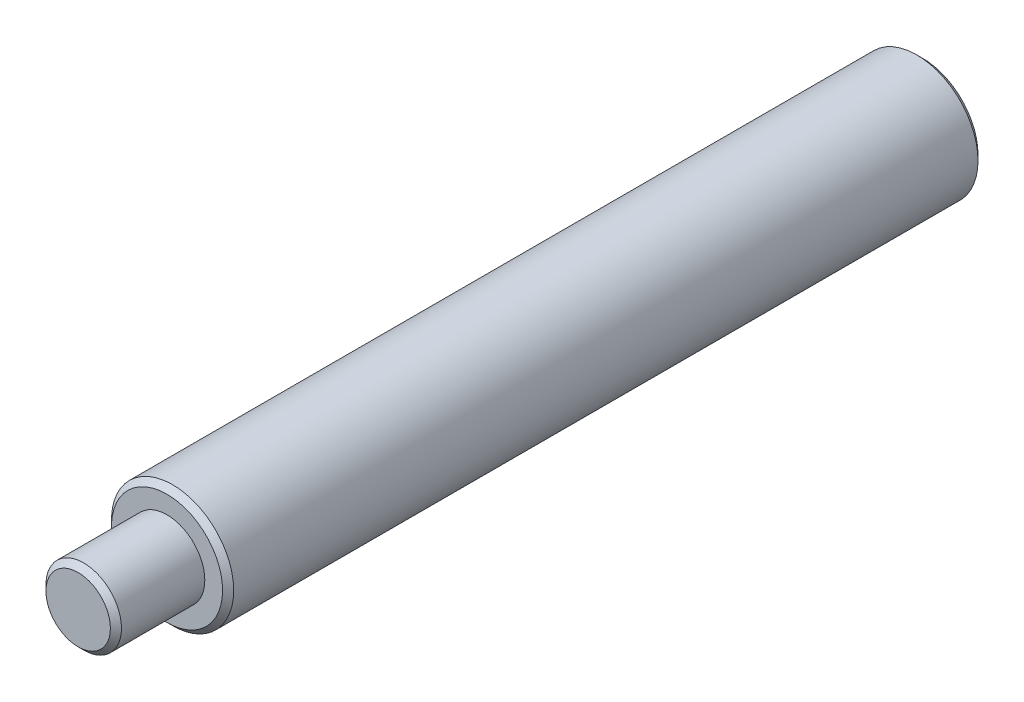
ISO-10303-21;
HEADER;
FILE_DESCRIPTION(('STEP AP214'),'2;1');
FILE_NAME('part.step','',(''),(''),'','','');
FILE_SCHEMA(('AUTOMOTIVE_DESIGN { 1 0 10303 214 1 1 1 1 }'));
ENDSEC;
DATA;
#1=APPLICATION_CONTEXT('core data for automotive mechanical design processes');
#2=APPLICATION_PROTOCOL_DEFINITION('international standard','automotive_design',2000,#1);
#3=PRODUCT_CONTEXT('',#1,'mechanical');
#4=PRODUCT('Part','Part','',(#3));
#5=PRODUCT_RELATED_PRODUCT_CATEGORY('part','',(#4));
#6=PRODUCT_DEFINITION_FORMATION('','',#4);
#7=PRODUCT_DEFINITION_CONTEXT('part definition',#1,'design');
#8=PRODUCT_DEFINITION('design','',#6,#7);
#9=PRODUCT_DEFINITION_SHAPE('','',#8);
#10=(LENGTH_UNIT() NAMED_UNIT(*) SI_UNIT(.MILLI.,.METRE.));
#11=(NAMED_UNIT(*) PLANE_ANGLE_UNIT() SI_UNIT($,.RADIAN.));
#12=(NAMED_UNIT(*) SI_UNIT($,.STERADIAN.) SOLID_ANGLE_UNIT());
#13=UNCERTAINTY_MEASURE_WITH_UNIT(LENGTH_MEASURE(1.E-05),#10,'distance_accuracy_value','');
#14=(GEOMETRIC_REPRESENTATION_CONTEXT(3) GLOBAL_UNCERTAINTY_ASSIGNED_CONTEXT((#13)) GLOBAL_UNIT_ASSIGNED_CONTEXT((#10,
#11,#12)) REPRESENTATION_CONTEXT('',''));
#15=CARTESIAN_POINT('',(0.,0.,0.));
#16=DIRECTION('',(0.,0.,1.));
#17=DIRECTION('',(1.,0.,0.));
#18=AXIS2_PLACEMENT_3D('',#15,#16,#17);
#19=CARTESIAN_POINT('',(0.,0.,68.));
#20=DIRECTION('',(0.,0.,1.));
#21=DIRECTION('',(1.,0.,0.));
#22=AXIS2_PLACEMENT_3D('',#19,#20,#21);
#23=PLANE('',#22);
#24=CARTESIAN_POINT('',(0.,0.,68.));
#25=DIRECTION('',(0.,0.,1.));
#26=DIRECTION('',(1.,0.,0.));
#27=AXIS2_PLACEMENT_3D('',#24,#25,#26);
#28=CIRCLE('',#27,5.);
#29=CARTESIAN_POINT('',(5.,0.,68.));
#30=VERTEX_POINT('',#29);
#31=EDGE_CURVE('E73',#30,#30,#28,.T.);
#32=ORIENTED_EDGE('',*,*,#31,.T.);
#33=EDGE_LOOP('',(#32));
#34=FACE_BOUND('',#33,.T.);
#35=CARTESIAN_POINT('',(0.,0.,68.));
#36=DIRECTION('',(0.,0.,1.));
#37=DIRECTION('',(1.,0.,0.));
#38=AXIS2_PLACEMENT_3D('',#35,#36,#37);
#39=CIRCLE('',#38,3.4);
#40=CARTESIAN_POINT('',(3.4,0.,68.));
#41=VERTEX_POINT('',#40);
#42=EDGE_CURVE('E59',#41,#41,#39,.T.);
#43=ORIENTED_EDGE('',*,*,#42,.F.);
#44=EDGE_LOOP('',(#43));
#45=FACE_BOUND('',#44,.T.);
#46=ADVANCED_FACE('F39',(#34,#45),#23,.T.);
#47=CARTESIAN_POINT('',(0.,0.,68.));
#48=DIRECTION('',(0.,0.,-1.));
#49=DIRECTION('',(-1.,0.,0.));
#50=AXIS2_PLACEMENT_3D('',#47,#48,#49);
#51=CYLINDRICAL_SURFACE('',#50,5.5);
#52=CARTESIAN_POINT('',(0.,0.,0.5));
#53=DIRECTION('',(0.,0.,1.));
#54=DIRECTION('',(1.,0.,0.));
#55=AXIS2_PLACEMENT_3D('',#52,#53,#54);
#56=CIRCLE('',#55,5.5);
#57=CARTESIAN_POINT('',(5.5,0.,0.5));
#58=VERTEX_POINT('',#57);
#59=EDGE_CURVE('E67',#58,#58,#56,.T.);
#60=ORIENTED_EDGE('',*,*,#59,.T.);
#61=EDGE_LOOP('',(#60));
#62=FACE_BOUND('',#61,.T.);
#63=CARTESIAN_POINT('',(0.,0.,67.5));
#64=DIRECTION('',(0.,0.,1.));
#65=DIRECTION('',(1.,0.,0.));
#66=AXIS2_PLACEMENT_3D('',#63,#64,#65);
#67=CIRCLE('',#66,5.5);
#68=CARTESIAN_POINT('',(5.5,0.,67.5));
#69=VERTEX_POINT('',#68);
#70=EDGE_CURVE('E62',#69,#69,#67,.F.);
#71=ORIENTED_EDGE('',*,*,#70,.T.);
#72=EDGE_LOOP('',(#71));
#73=FACE_BOUND('',#72,.T.);
#74=ADVANCED_FACE('F93',(#62,#73),#51,.T.);
#75=CARTESIAN_POINT('',(0.,0.,0.));
#76=DIRECTION('',(0.,0.,1.));
#77=DIRECTION('',(1.,0.,0.));
#78=AXIS2_PLACEMENT_3D('',#75,#76,#77);
#79=PLANE('',#78);
#80=CARTESIAN_POINT('',(0.,0.,0.));
#81=DIRECTION('',(0.,0.,1.));
#82=DIRECTION('',(1.,0.,0.));
#83=AXIS2_PLACEMENT_3D('',#80,#81,#82);
#84=CIRCLE('',#83,2.59999999999999);
#85=CARTESIAN_POINT('',(2.59999999999999,0.,0.));
#86=VERTEX_POINT('',#85);
#87=EDGE_CURVE('E11',#86,#86,#84,.T.);
#88=ORIENTED_EDGE('',*,*,#87,.T.);
#89=EDGE_LOOP('',(#88));
#90=FACE_BOUND('',#89,.T.);
#91=CARTESIAN_POINT('',(0.,0.,0.));
#92=DIRECTION('',(0.,0.,1.));
#93=DIRECTION('',(1.,0.,0.));
#94=AXIS2_PLACEMENT_3D('',#91,#92,#93);
#95=CIRCLE('',#94,4.99999999999999);
#96=CARTESIAN_POINT('',(4.99999999999999,0.,0.));
#97=VERTEX_POINT('',#96);
#98=EDGE_CURVE('E70',#97,#97,#95,.F.);
#99=ORIENTED_EDGE('',*,*,#98,.T.);
#100=EDGE_LOOP('',(#99));
#101=FACE_BOUND('',#100,.T.);
#102=ADVANCED_FACE('F99',(#90,#101),#79,.F.);
#103=CARTESIAN_POINT('',(0.,0.,0.5));
#104=DIRECTION('',(0.,0.,1.));
#105=DIRECTION('',(1.,0.,0.));
#106=AXIS2_PLACEMENT_3D('',#103,#104,#105);
#107=CONICAL_SURFACE('',#106,5.5,0.785398163397457);
#108=ORIENTED_EDGE('',*,*,#98,.F.);
#109=EDGE_LOOP('',(#108));
#110=FACE_BOUND('',#109,.T.);
#111=ORIENTED_EDGE('',*,*,#59,.F.);
#112=EDGE_LOOP('',(#111));
#113=FACE_BOUND('',#112,.T.);
#114=ADVANCED_FACE('F108',(#110,#113),#107,.T.);
#115=CARTESIAN_POINT('',(0.,0.,68.));
#116=DIRECTION('',(0.,0.,-1.));
#117=DIRECTION('',(-1.,0.,0.));
#118=AXIS2_PLACEMENT_3D('',#115,#116,#117);
#119=CONICAL_SURFACE('',#118,5.,0.785398163397457);
#120=ORIENTED_EDGE('',*,*,#70,.F.);
#121=EDGE_LOOP('',(#120));
#122=FACE_BOUND('',#121,.T.);
#123=ORIENTED_EDGE('',*,*,#31,.F.);
#124=EDGE_LOOP('',(#123));
#125=FACE_BOUND('',#124,.T.);
#126=ADVANCED_FACE('F113',(#122,#125),#119,.T.);
#127=CARTESIAN_POINT('',(0.,0.,76.));
#128=DIRECTION('',(0.,0.,-1.));
#129=DIRECTION('',(-1.,0.,0.));
#130=AXIS2_PLACEMENT_3D('',#127,#128,#129);
#131=CYLINDRICAL_SURFACE('',#130,3.4);
#132=CARTESIAN_POINT('',(0.,0.,75.5));
#133=DIRECTION('',(0.,0.,1.));
#134=DIRECTION('',(1.,0.,0.));
#135=AXIS2_PLACEMENT_3D('',#132,#133,#134);
#136=CIRCLE('',#135,3.4);
#137=CARTESIAN_POINT('',(3.4,0.,75.5));
#138=VERTEX_POINT('',#137);
#139=EDGE_CURVE('E79',#138,#138,#136,.F.);
#140=ORIENTED_EDGE('',*,*,#139,.T.);
#141=EDGE_LOOP('',(#140));
#142=FACE_BOUND('',#141,.T.);
#143=ORIENTED_EDGE('',*,*,#42,.T.);
#144=EDGE_LOOP('',(#143));
#145=FACE_BOUND('',#144,.T.);
#146=ADVANCED_FACE('F105',(#142,#145),#131,.T.);
#147=CARTESIAN_POINT('',(0.,0.,76.));
#148=DIRECTION('',(0.,0.,1.));
#149=DIRECTION('',(1.,0.,0.));
#150=AXIS2_PLACEMENT_3D('',#147,#148,#149);
#151=PLANE('',#150);
#152=CARTESIAN_POINT('',(0.,0.,76.));
#153=DIRECTION('',(0.,0.,1.));
#154=DIRECTION('',(1.,0.,0.));
#155=AXIS2_PLACEMENT_3D('',#152,#153,#154);
#156=CIRCLE('',#155,2.90000000000001);
#157=CARTESIAN_POINT('',(2.90000000000001,0.,76.));
#158=VERTEX_POINT('',#157);
#159=EDGE_CURVE('E76',#158,#158,#156,.T.);
#160=ORIENTED_EDGE('',*,*,#159,.T.);
#161=EDGE_LOOP('',(#160));
#162=FACE_BOUND('',#161,.T.);
#163=ADVANCED_FACE('F118',(#162),#151,.T.);
#164=CARTESIAN_POINT('',(0.,0.,76.));
#165=DIRECTION('',(0.,0.,-1.));
#166=DIRECTION('',(-1.,0.,0.));
#167=AXIS2_PLACEMENT_3D('',#164,#165,#166);
#168=CONICAL_SURFACE('',#167,2.90000000000001,0.785398163397434);
#169=ORIENTED_EDGE('',*,*,#139,.F.);
#170=EDGE_LOOP('',(#169));
#171=FACE_BOUND('',#170,.T.);
#172=ORIENTED_EDGE('',*,*,#159,.F.);
#173=EDGE_LOOP('',(#172));
#174=FACE_BOUND('',#173,.T.);
#175=ADVANCED_FACE('F53',(#171,#174),#168,.T.);
#176=CARTESIAN_POINT('',(0.,0.,12.4));
#177=DIRECTION('',(0.,0.,-1.));
#178=DIRECTION('',(-1.,0.,0.));
#179=AXIS2_PLACEMENT_3D('',#176,#177,#178);
#180=CONICAL_SURFACE('',#179,2.1,1.02974425867665);
#181=CARTESIAN_POINT('',(0.,0.,13.6618072999579));
#182=VERTEX_POINT('',#181);
#183=VERTEX_LOOP('',#182);
#184=FACE_BOUND('',#183,.T.);
#185=CARTESIAN_POINT('',(0.,0.,12.4));
#186=DIRECTION('',(0.,0.,-1.));
#187=DIRECTION('',(-1.,0.,0.));
#188=AXIS2_PLACEMENT_3D('',#185,#186,#187);
#189=CIRCLE('',#188,2.1);
#190=CARTESIAN_POINT('',(-2.1,0.,12.4));
#191=VERTEX_POINT('',#190);
#192=EDGE_CURVE('E57',#191,#191,#189,.T.);
#193=ORIENTED_EDGE('',*,*,#192,.T.);
#194=EDGE_LOOP('',(#193));
#195=FACE_BOUND('',#194,.T.);
#196=ADVANCED_FACE('F49',(#184,#195),#180,.F.);
#197=CARTESIAN_POINT('',(0.,0.,0.));
#198=DIRECTION('',(0.,0.,-1.));
#199=DIRECTION('',(-1.,0.,0.));
#200=AXIS2_PLACEMENT_3D('',#197,#198,#199);
#201=CYLINDRICAL_SURFACE('',#200,2.1);
#202=CARTESIAN_POINT('',(0.,0.,0.499999999999993));
#203=DIRECTION('',(0.,0.,1.));
#204=DIRECTION('',(1.,0.,0.));
#205=AXIS2_PLACEMENT_3D('',#202,#203,#204);
#206=CIRCLE('',#205,2.1);
#207=CARTESIAN_POINT('',(2.1,0.,0.499999999999993));
#208=VERTEX_POINT('',#207);
#209=EDGE_CURVE('E46',#208,#208,#206,.F.);
#210=ORIENTED_EDGE('',*,*,#209,.T.);
#211=EDGE_LOOP('',(#210));
#212=FACE_BOUND('',#211,.T.);
#213=ORIENTED_EDGE('',*,*,#192,.F.);
#214=EDGE_LOOP('',(#213));
#215=FACE_BOUND('',#214,.T.);
#216=ADVANCED_FACE('F52',(#212,#215),#201,.F.);
#217=CARTESIAN_POINT('',(0.,0.,0.499999999999993));
#218=DIRECTION('',(0.,0.,-1.));
#219=DIRECTION('',(-1.,0.,0.));
#220=AXIS2_PLACEMENT_3D('',#217,#218,#219);
#221=CONICAL_SURFACE('',#220,2.1,0.785398163397448);
#222=ORIENTED_EDGE('',*,*,#87,.F.);
#223=EDGE_LOOP('',(#222));
#224=FACE_BOUND('',#223,.T.);
#225=ORIENTED_EDGE('',*,*,#209,.F.);
#226=EDGE_LOOP('',(#225));
#227=FACE_BOUND('',#226,.T.);
#228=ADVANCED_FACE('F41',(#224,#227),#221,.F.);
#229=CLOSED_SHELL('',(#46,#74,#102,#114,#126,#146,#163,#175,#196,#216,#228));
#230=MANIFOLD_SOLID_BREP('B2',#229);
#231=ADVANCED_BREP_SHAPE_REPRESENTATION('',(#18,#230),#14);
#232=SHAPE_DEFINITION_REPRESENTATION(#9,#231);
ENDSEC;
END-ISO-10303-21;
